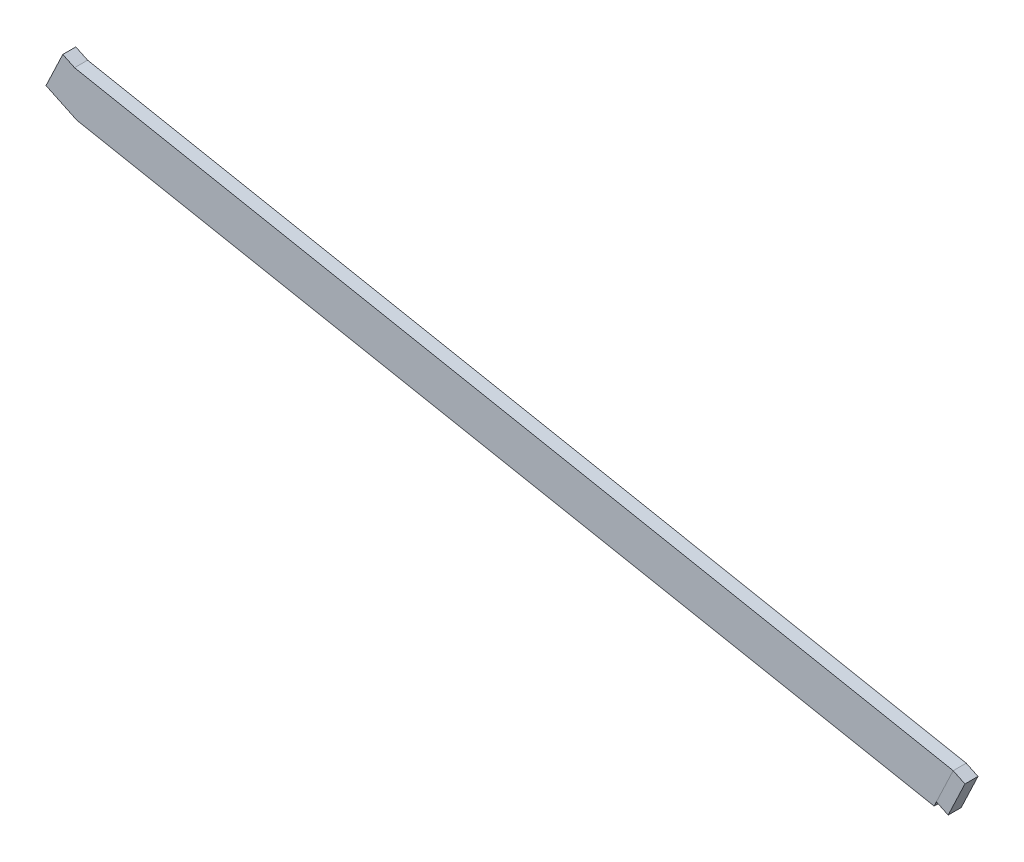
ISO-10303-21;
HEADER;
FILE_DESCRIPTION(('STEP AP214'),'2;1');
FILE_NAME('part.step','',(''),(''),'','','');
FILE_SCHEMA(('AUTOMOTIVE_DESIGN { 1 0 10303 214 1 1 1 1 }'));
ENDSEC;
DATA;
#1=APPLICATION_CONTEXT('core data for automotive mechanical design processes');
#2=APPLICATION_PROTOCOL_DEFINITION('international standard','automotive_design',2000,#1);
#3=PRODUCT_CONTEXT('',#1,'mechanical');
#4=PRODUCT('Part','Part','',(#3));
#5=PRODUCT_RELATED_PRODUCT_CATEGORY('part','',(#4));
#6=PRODUCT_DEFINITION_FORMATION('','',#4);
#7=PRODUCT_DEFINITION_CONTEXT('part definition',#1,'design');
#8=PRODUCT_DEFINITION('design','',#6,#7);
#9=PRODUCT_DEFINITION_SHAPE('','',#8);
#10=(LENGTH_UNIT() NAMED_UNIT(*) SI_UNIT(.MILLI.,.METRE.));
#11=(NAMED_UNIT(*) PLANE_ANGLE_UNIT() SI_UNIT($,.RADIAN.));
#12=(NAMED_UNIT(*) SI_UNIT($,.STERADIAN.) SOLID_ANGLE_UNIT());
#13=UNCERTAINTY_MEASURE_WITH_UNIT(LENGTH_MEASURE(1.E-05),#10,'distance_accuracy_value','');
#14=(GEOMETRIC_REPRESENTATION_CONTEXT(3) GLOBAL_UNCERTAINTY_ASSIGNED_CONTEXT((#13)) GLOBAL_UNIT_ASSIGNED_CONTEXT((#10,
#11,#12)) REPRESENTATION_CONTEXT('',''));
#15=CARTESIAN_POINT('',(0.,0.,0.));
#16=DIRECTION('',(0.,0.,1.));
#17=DIRECTION('',(1.,0.,0.));
#18=AXIS2_PLACEMENT_3D('',#15,#16,#17);
#19=CARTESIAN_POINT('',(183.384864160832,-86.993736773142,0.));
#20=DIRECTION('',(-0.903495201013096,0.428598205486567,0.));
#21=DIRECTION('',(-0.428598205486567,-0.903495201013096,0.));
#22=AXIS2_PLACEMENT_3D('',#19,#20,#21);
#23=PLANE('',#22);
#24=DIRECTION('',(-0.428598205486567,-0.903495201013096,0.));
#25=VECTOR('',#24,1.);
#26=CARTESIAN_POINT('',(183.384864160832,-86.993736773142,3.175));
#27=LINE('',#26,#25);
#28=CARTESIAN_POINT('',(233.689675114,19.05,3.175));
#29=VERTEX_POINT('',#28);
#30=CARTESIAN_POINT('',(229.045813197795,9.26062873864451,3.175));
#31=VERTEX_POINT('',#30);
#32=EDGE_CURVE('E139',#29,#31,#27,.T.);
#33=ORIENTED_EDGE('',*,*,#32,.T.);
#34=DIRECTION('',(0.,0.,1.));
#35=VECTOR('',#34,1.);
#36=CARTESIAN_POINT('',(229.045813197795,9.26062873864451,0.));
#37=LINE('',#36,#35);
#38=CARTESIAN_POINT('',(229.045813197795,9.26062873864451,0.));
#39=VERTEX_POINT('',#38);
#40=EDGE_CURVE('E12',#39,#31,#37,.T.);
#41=ORIENTED_EDGE('',*,*,#40,.F.);
#42=DIRECTION('',(-0.428598205486567,-0.903495201013096,0.));
#43=VECTOR('',#42,1.);
#44=CARTESIAN_POINT('',(183.384864160832,-86.993736773142,0.));
#45=LINE('',#44,#43);
#46=CARTESIAN_POINT('',(233.689675114,19.05,0.));
#47=VERTEX_POINT('',#46);
#48=EDGE_CURVE('E70',#47,#39,#45,.T.);
#49=ORIENTED_EDGE('',*,*,#48,.F.);
#50=DIRECTION('',(0.,0.,1.));
#51=VECTOR('',#50,1.);
#52=CARTESIAN_POINT('',(233.689675114,19.05,0.));
#53=LINE('',#52,#51);
#54=EDGE_CURVE('E54',#47,#29,#53,.T.);
#55=ORIENTED_EDGE('',*,*,#54,.T.);
#56=EDGE_LOOP('',(#33,#41,#49,#55));
#57=FACE_BOUND('',#56,.T.);
#58=ADVANCED_FACE('F51',(#57),#23,.F.);
#59=CARTESIAN_POINT('',(9.93992586369441,51.5273941031254,0.));
#60=DIRECTION('',(-0.189413563796688,-0.98189739884055,0.));
#61=DIRECTION('',(0.98189739884055,-0.189413563796688,0.));
#62=AXIS2_PLACEMENT_3D('',#59,#60,#61);
#63=PLANE('',#62);
#64=DIRECTION('',(0.98189739884055,-0.189413563796688,0.));
#65=VECTOR('',#64,1.);
#66=CARTESIAN_POINT('',(9.93992586369441,51.5273941031254,3.175));
#67=LINE('',#66,#65);
#68=CARTESIAN_POINT('',(20.3570666460194,49.517868706193,3.175));
#69=VERTEX_POINT('',#68);
#70=EDGE_CURVE('E153',#69,#31,#67,.T.);
#71=ORIENTED_EDGE('',*,*,#70,.F.);
#72=DIRECTION('',(0.,0.,1.));
#73=VECTOR('',#72,1.);
#74=CARTESIAN_POINT('',(20.3570666460194,49.517868706193,0.));
#75=LINE('',#74,#73);
#76=CARTESIAN_POINT('',(20.3570666460194,49.517868706193,0.));
#77=VERTEX_POINT('',#76);
#78=EDGE_CURVE('E61',#77,#69,#75,.T.);
#79=ORIENTED_EDGE('',*,*,#78,.F.);
#80=DIRECTION('',(0.98189739884055,-0.189413563796688,0.));
#81=VECTOR('',#80,1.);
#82=CARTESIAN_POINT('',(9.93992586369441,51.5273941031254,0.));
#83=LINE('',#82,#81);
#84=EDGE_CURVE('E115',#77,#39,#83,.T.);
#85=ORIENTED_EDGE('',*,*,#84,.T.);
#86=ORIENTED_EDGE('',*,*,#40,.T.);
#87=EDGE_LOOP('',(#71,#79,#85,#86));
#88=FACE_BOUND('',#87,.T.);
#89=ADVANCED_FACE('F173',(#88),#63,.T.);
#90=CARTESIAN_POINT('',(22.9146425940599,48.3046110591168,0.));
#91=DIRECTION('',(0.428598205486556,0.903495201013101,0.));
#92=DIRECTION('',(-0.903495201013101,0.428598205486556,0.));
#93=AXIS2_PLACEMENT_3D('',#90,#91,#92);
#94=PLANE('',#93);
#95=DIRECTION('',(-0.903495201013101,0.428598205486556,0.));
#96=VECTOR('',#95,1.);
#97=CARTESIAN_POINT('',(22.9146425940599,48.3046110591168,3.175));
#98=LINE('',#97,#96);
#99=CARTESIAN_POINT('',(12.8987137616562,53.0559468924845,3.175));
#100=VERTEX_POINT('',#99);
#101=EDGE_CURVE('E121',#69,#100,#98,.T.);
#102=ORIENTED_EDGE('',*,*,#101,.T.);
#103=DIRECTION('',(0.,0.,1.));
#104=VECTOR('',#103,1.);
#105=CARTESIAN_POINT('',(12.8987137616562,53.0559468924845,0.));
#106=LINE('',#105,#104);
#107=CARTESIAN_POINT('',(12.8987137616562,53.0559468924845,0.));
#108=VERTEX_POINT('',#107);
#109=EDGE_CURVE('E119',#108,#100,#106,.T.);
#110=ORIENTED_EDGE('',*,*,#109,.F.);
#111=DIRECTION('',(-0.903495201013101,0.428598205486556,0.));
#112=VECTOR('',#111,1.);
#113=CARTESIAN_POINT('',(22.9146425940599,48.3046110591168,0.));
#114=LINE('',#113,#112);
#115=EDGE_CURVE('E109',#77,#108,#114,.T.);
#116=ORIENTED_EDGE('',*,*,#115,.F.);
#117=ORIENTED_EDGE('',*,*,#78,.T.);
#118=EDGE_LOOP('',(#102,#110,#116,#117));
#119=FACE_BOUND('',#118,.T.);
#120=ADVANCED_FACE('F120',(#119),#94,.F.);
#121=CARTESIAN_POINT('',(-10.0159288324037,4.75133583336768,0.));
#122=DIRECTION('',(0.903495201013101,-0.428598205486556,0.));
#123=DIRECTION('',(0.428598205486556,0.903495201013101,0.));
#124=AXIS2_PLACEMENT_3D('',#121,#122,#123);
#125=PLANE('',#124);
#126=DIRECTION('',(0.428598205486556,0.903495201013101,0.));
#127=VECTOR('',#126,1.);
#128=CARTESIAN_POINT('',(-10.0159288324037,4.75133583336768,3.175));
#129=LINE('',#128,#127);
#130=CARTESIAN_POINT('',(16.9811116689157,61.6617386821343,3.175));
#131=VERTEX_POINT('',#130);
#132=EDGE_CURVE('E148',#100,#131,#129,.T.);
#133=ORIENTED_EDGE('',*,*,#132,.T.);
#134=DIRECTION('',(0.,0.,1.));
#135=VECTOR('',#134,1.);
#136=CARTESIAN_POINT('',(16.9811116689157,61.6617386821343,0.));
#137=LINE('',#136,#135);
#138=CARTESIAN_POINT('',(16.9811116689157,61.6617386821343,0.));
#139=VERTEX_POINT('',#138);
#140=EDGE_CURVE('E125',#139,#131,#137,.T.);
#141=ORIENTED_EDGE('',*,*,#140,.F.);
#142=DIRECTION('',(0.428598205486556,0.903495201013101,0.));
#143=VECTOR('',#142,1.);
#144=CARTESIAN_POINT('',(-10.0159288324037,4.75133583336768,0.));
#145=LINE('',#144,#143);
#146=EDGE_CURVE('E113',#108,#139,#145,.T.);
#147=ORIENTED_EDGE('',*,*,#146,.F.);
#148=ORIENTED_EDGE('',*,*,#109,.T.);
#149=EDGE_LOOP('',(#133,#141,#147,#148));
#150=FACE_BOUND('',#149,.T.);
#151=ADVANCED_FACE('F127',(#150),#125,.F.);
#152=CARTESIAN_POINT('',(26.9970405013194,56.9104028487667,0.));
#153=DIRECTION('',(-0.428598205486556,-0.903495201013101,0.));
#154=DIRECTION('',(0.903495201013101,-0.428598205486556,0.));
#155=AXIS2_PLACEMENT_3D('',#152,#153,#154);
#156=PLANE('',#155);
#157=DIRECTION('',(0.903495201013101,-0.428598205486556,0.));
#158=VECTOR('',#157,1.);
#159=CARTESIAN_POINT('',(26.9970405013194,56.9104028487667,3.175));
#160=LINE('',#159,#158);
#161=CARTESIAN_POINT('',(19.8497089321323,60.3009393797145,3.175));
#162=VERTEX_POINT('',#161);
#163=EDGE_CURVE('E145',#131,#162,#160,.T.);
#164=ORIENTED_EDGE('',*,*,#163,.T.);
#165=DIRECTION('',(0.,0.,1.));
#166=VECTOR('',#165,1.);
#167=CARTESIAN_POINT('',(19.8497089321323,60.3009393797145,0.));
#168=LINE('',#167,#166);
#169=CARTESIAN_POINT('',(19.8497089321323,60.3009393797145,0.));
#170=VERTEX_POINT('',#169);
#171=EDGE_CURVE('E160',#170,#162,#168,.T.);
#172=ORIENTED_EDGE('',*,*,#171,.F.);
#173=DIRECTION('',(0.903495201013101,-0.428598205486556,0.));
#174=VECTOR('',#173,1.);
#175=CARTESIAN_POINT('',(26.9970405013194,56.9104028487667,0.));
#176=LINE('',#175,#174);
#177=EDGE_CURVE('E131',#139,#170,#176,.T.);
#178=ORIENTED_EDGE('',*,*,#177,.F.);
#179=ORIENTED_EDGE('',*,*,#140,.T.);
#180=EDGE_LOOP('',(#164,#172,#178,#179));
#181=FACE_BOUND('',#180,.T.);
#182=ADVANCED_FACE('F186',(#181),#156,.F.);
#183=CARTESIAN_POINT('',(11.927209147239,61.829234413602,0.));
#184=DIRECTION('',(-0.189413563796688,-0.98189739884055,0.));
#185=DIRECTION('',(0.98189739884055,-0.189413563796688,0.));
#186=AXIS2_PLACEMENT_3D('',#183,#184,#185);
#187=PLANE('',#186);
#188=DIRECTION('',(0.98189739884055,-0.189413563796688,0.));
#189=VECTOR('',#188,1.);
#190=CARTESIAN_POINT('',(11.927209147239,61.829234413602,3.175));
#191=LINE('',#190,#189);
#192=EDGE_CURVE('E142',#162,#29,#191,.T.);
#193=ORIENTED_EDGE('',*,*,#192,.T.);
#194=ORIENTED_EDGE('',*,*,#54,.F.);
#195=DIRECTION('',(0.98189739884055,-0.189413563796688,0.));
#196=VECTOR('',#195,1.);
#197=CARTESIAN_POINT('',(11.927209147239,61.829234413602,0.));
#198=LINE('',#197,#196);
#199=EDGE_CURVE('E102',#170,#47,#198,.T.);
#200=ORIENTED_EDGE('',*,*,#199,.F.);
#201=ORIENTED_EDGE('',*,*,#171,.T.);
#202=EDGE_LOOP('',(#193,#194,#200,#201));
#203=FACE_BOUND('',#202,.T.);
#204=ADVANCED_FACE('F188',(#203),#187,.F.);
#205=CARTESIAN_POINT('',(0.,0.,0.));
#206=DIRECTION('',(0.,0.,1.));
#207=DIRECTION('',(1.,0.,0.));
#208=AXIS2_PLACEMENT_3D('',#205,#206,#207);
#209=PLANE('',#208);
#210=ORIENTED_EDGE('',*,*,#48,.T.);
#211=ORIENTED_EDGE('',*,*,#84,.F.);
#212=ORIENTED_EDGE('',*,*,#115,.T.);
#213=ORIENTED_EDGE('',*,*,#146,.T.);
#214=ORIENTED_EDGE('',*,*,#177,.T.);
#215=ORIENTED_EDGE('',*,*,#199,.T.);
#216=EDGE_LOOP('',(#210,#211,#212,#213,#214,#215));
#217=FACE_BOUND('',#216,.T.);
#218=ADVANCED_FACE('F111',(#217),#209,.F.);
#219=CARTESIAN_POINT('',(0.,0.,3.175));
#220=DIRECTION('',(0.,0.,1.));
#221=DIRECTION('',(1.,0.,0.));
#222=AXIS2_PLACEMENT_3D('',#219,#220,#221);
#223=PLANE('',#222);
#224=ORIENTED_EDGE('',*,*,#32,.F.);
#225=ORIENTED_EDGE('',*,*,#192,.F.);
#226=ORIENTED_EDGE('',*,*,#163,.F.);
#227=ORIENTED_EDGE('',*,*,#132,.F.);
#228=ORIENTED_EDGE('',*,*,#101,.F.);
#229=ORIENTED_EDGE('',*,*,#70,.T.);
#230=EDGE_LOOP('',(#224,#225,#226,#227,#228,#229));
#231=FACE_BOUND('',#230,.T.);
#232=ADVANCED_FACE('F171',(#231),#223,.T.);
#233=CLOSED_SHELL('',(#58,#89,#120,#151,#182,#204,#218,#232));
#234=MANIFOLD_SOLID_BREP('B2',#233);
#235=CARTESIAN_POINT('',(0.,0.,3.175));
#236=DIRECTION('',(0.,0.,1.));
#237=DIRECTION('',(1.,0.,0.));
#238=AXIS2_PLACEMENT_3D('',#235,#236,#237);
#239=PLANE('',#238);
#240=DIRECTION('',(0.428598205486562,0.903495201013098,0.));
#241=VECTOR('',#240,1.);
#242=CARTESIAN_POINT('',(233.689675114,19.05,3.175));
#243=LINE('',#242,#241);
#244=CARTESIAN_POINT('',(229.607277206741,10.4442082103502,3.175));
#245=VERTEX_POINT('',#244);
#246=CARTESIAN_POINT('',(233.689675114,19.05,3.175));
#247=VERTEX_POINT('',#246);
#248=EDGE_CURVE('E271',#245,#247,#243,.T.);
#249=ORIENTED_EDGE('',*,*,#248,.F.);
#250=DIRECTION('',(-0.903495201013097,0.428598205486564,0.));
#251=VECTOR('',#250,1.);
#252=CARTESIAN_POINT('',(46.2224130459081,97.4379449834918,3.175));
#253=LINE('',#252,#251);
#254=CARTESIAN_POINT('',(232.475874469957,9.08340890793041,3.175));
#255=VERTEX_POINT('',#254);
#256=EDGE_CURVE('E297',#255,#245,#253,.T.);
#257=ORIENTED_EDGE('',*,*,#256,.F.);
#258=DIRECTION('',(-0.428598205486562,-0.903495201013098,0.));
#259=VECTOR('',#258,1.);
#260=CARTESIAN_POINT('',(186.253461424049,-88.3545360755612,3.175));
#261=LINE('',#260,#259);
#262=CARTESIAN_POINT('',(236.558272377217,17.6892006975802,3.175));
#263=VERTEX_POINT('',#262);
#264=EDGE_CURVE('E305',#263,#255,#261,.T.);
#265=ORIENTED_EDGE('',*,*,#264,.F.);
#266=DIRECTION('',(0.903495201013098,-0.428598205486563,0.));
#267=VECTOR('',#266,1.);
#268=CARTESIAN_POINT('',(50.3048109531674,106.043736773141,3.175));
#269=LINE('',#268,#267);
#270=EDGE_CURVE('E310',#247,#263,#269,.T.);
#271=ORIENTED_EDGE('',*,*,#270,.F.);
#272=EDGE_LOOP('',(#249,#257,#265,#271));
#273=FACE_BOUND('',#272,.T.);
#274=ADVANCED_FACE('F254',(#273),#239,.T.);
#275=CARTESIAN_POINT('',(0.,0.,0.));
#276=DIRECTION('',(0.,0.,1.));
#277=DIRECTION('',(1.,0.,0.));
#278=AXIS2_PLACEMENT_3D('',#275,#276,#277);
#279=PLANE('',#278);
#280=DIRECTION('',(-0.903495201013097,0.428598205486564,0.));
#281=VECTOR('',#280,1.);
#282=CARTESIAN_POINT('',(46.2224130459081,97.4379449834918,0.));
#283=LINE('',#282,#281);
#284=CARTESIAN_POINT('',(232.475874469957,9.08340890793041,0.));
#285=VERTEX_POINT('',#284);
#286=CARTESIAN_POINT('',(229.607277206741,10.4442082103502,0.));
#287=VERTEX_POINT('',#286);
#288=EDGE_CURVE('E299',#285,#287,#283,.T.);
#289=ORIENTED_EDGE('',*,*,#288,.T.);
#290=DIRECTION('',(0.428598205486562,0.903495201013098,0.));
#291=VECTOR('',#290,1.);
#292=CARTESIAN_POINT('',(233.689675114,19.05,0.));
#293=LINE('',#292,#291);
#294=CARTESIAN_POINT('',(233.689675114,19.05,0.));
#295=VERTEX_POINT('',#294);
#296=EDGE_CURVE('E290',#287,#295,#293,.T.);
#297=ORIENTED_EDGE('',*,*,#296,.T.);
#298=DIRECTION('',(0.903495201013098,-0.428598205486563,0.));
#299=VECTOR('',#298,1.);
#300=CARTESIAN_POINT('',(50.3048109531674,106.043736773141,0.));
#301=LINE('',#300,#299);
#302=CARTESIAN_POINT('',(236.558272377217,17.6892006975802,0.));
#303=VERTEX_POINT('',#302);
#304=EDGE_CURVE('E307',#295,#303,#301,.T.);
#305=ORIENTED_EDGE('',*,*,#304,.T.);
#306=DIRECTION('',(-0.428598205486562,-0.903495201013098,0.));
#307=VECTOR('',#306,1.);
#308=CARTESIAN_POINT('',(186.253461424049,-88.3545360755612,0.));
#309=LINE('',#308,#307);
#310=EDGE_CURVE('E317',#303,#285,#309,.T.);
#311=ORIENTED_EDGE('',*,*,#310,.T.);
#312=EDGE_LOOP('',(#289,#297,#305,#311));
#313=FACE_BOUND('',#312,.T.);
#314=ADVANCED_FACE('F326',(#313),#279,.F.);
#315=CARTESIAN_POINT('',(46.2224130459081,97.4379449834918,3.175));
#316=DIRECTION('',(-0.428598205486564,-0.903495201013097,0.));
#317=DIRECTION('',(0.903495201013097,-0.428598205486564,0.));
#318=AXIS2_PLACEMENT_3D('',#315,#316,#317);
#319=PLANE('',#318);
#320=ORIENTED_EDGE('',*,*,#288,.F.);
#321=DIRECTION('',(0.,0.,-1.));
#322=VECTOR('',#321,1.);
#323=CARTESIAN_POINT('',(232.475874469957,9.08340890793041,3.175));
#324=LINE('',#323,#322);
#325=EDGE_CURVE('E263',#255,#285,#324,.T.);
#326=ORIENTED_EDGE('',*,*,#325,.F.);
#327=ORIENTED_EDGE('',*,*,#256,.T.);
#328=DIRECTION('',(0.,0.,-1.));
#329=VECTOR('',#328,1.);
#330=CARTESIAN_POINT('',(229.60727720674,10.4442082103502,3.175));
#331=LINE('',#330,#329);
#332=EDGE_CURVE('E49',#245,#287,#331,.T.);
#333=ORIENTED_EDGE('',*,*,#332,.T.);
#334=EDGE_LOOP('',(#320,#326,#327,#333));
#335=FACE_BOUND('',#334,.T.);
#336=ADVANCED_FACE('F256',(#335),#319,.T.);
#337=CARTESIAN_POINT('',(186.253461424049,-88.3545360755612,3.175));
#338=DIRECTION('',(0.903495201013098,-0.428598205486562,0.));
#339=DIRECTION('',(0.428598205486562,0.903495201013098,0.));
#340=AXIS2_PLACEMENT_3D('',#337,#338,#339);
#341=PLANE('',#340);
#342=ORIENTED_EDGE('',*,*,#310,.F.);
#343=DIRECTION('',(0.,0.,-1.));
#344=VECTOR('',#343,1.);
#345=CARTESIAN_POINT('',(236.558272377217,17.6892006975802,3.175));
#346=LINE('',#345,#344);
#347=EDGE_CURVE('E301',#263,#303,#346,.T.);
#348=ORIENTED_EDGE('',*,*,#347,.F.);
#349=ORIENTED_EDGE('',*,*,#264,.T.);
#350=ORIENTED_EDGE('',*,*,#325,.T.);
#351=EDGE_LOOP('',(#342,#348,#349,#350));
#352=FACE_BOUND('',#351,.T.);
#353=ADVANCED_FACE('F309',(#352),#341,.T.);
#354=CARTESIAN_POINT('',(50.3048109531674,106.043736773141,3.175));
#355=DIRECTION('',(0.428598205486563,0.903495201013098,0.));
#356=DIRECTION('',(-0.903495201013098,0.428598205486563,0.));
#357=AXIS2_PLACEMENT_3D('',#354,#355,#356);
#358=PLANE('',#357);
#359=ORIENTED_EDGE('',*,*,#304,.F.);
#360=DIRECTION('',(0.,0.,-1.));
#361=VECTOR('',#360,1.);
#362=CARTESIAN_POINT('',(233.689675114,19.05,3.175));
#363=LINE('',#362,#361);
#364=EDGE_CURVE('E312',#247,#295,#363,.T.);
#365=ORIENTED_EDGE('',*,*,#364,.F.);
#366=ORIENTED_EDGE('',*,*,#270,.T.);
#367=ORIENTED_EDGE('',*,*,#347,.T.);
#368=EDGE_LOOP('',(#359,#365,#366,#367));
#369=FACE_BOUND('',#368,.T.);
#370=ADVANCED_FACE('F324',(#369),#358,.T.);
#371=CARTESIAN_POINT('',(233.689675114,19.05,0.));
#372=DIRECTION('',(0.903495201013098,-0.428598205486562,0.));
#373=DIRECTION('',(0.428598205486562,0.903495201013098,0.));
#374=AXIS2_PLACEMENT_3D('',#371,#372,#373);
#375=PLANE('',#374);
#376=ORIENTED_EDGE('',*,*,#332,.F.);
#377=ORIENTED_EDGE('',*,*,#248,.T.);
#378=ORIENTED_EDGE('',*,*,#364,.T.);
#379=ORIENTED_EDGE('',*,*,#296,.F.);
#380=EDGE_LOOP('',(#376,#377,#378,#379));
#381=FACE_BOUND('',#380,.T.);
#382=ADVANCED_FACE('F328',(#381),#375,.F.);
#383=CLOSED_SHELL('',(#274,#314,#336,#353,#370,#382));
#384=MANIFOLD_SOLID_BREP('B6',#383);
#385=ADVANCED_BREP_SHAPE_REPRESENTATION('',(#18,#234,#384),#14);
#386=SHAPE_DEFINITION_REPRESENTATION(#9,#385);
ENDSEC;
END-ISO-10303-21;
